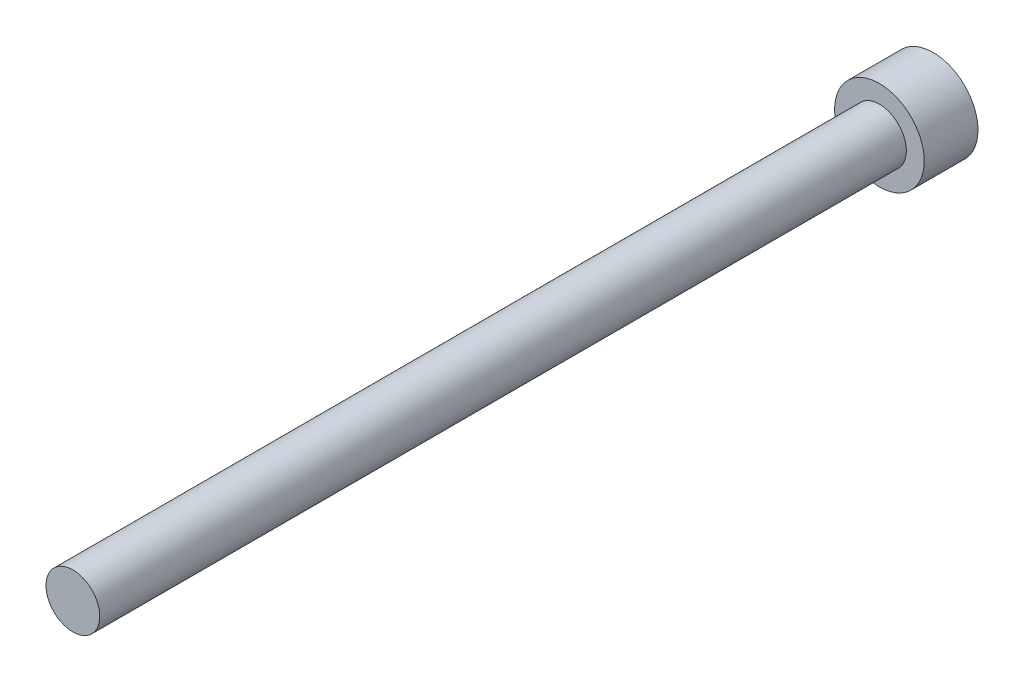
ISO-10303-21;
HEADER;
FILE_DESCRIPTION(('STEP AP214'),'2;1');
FILE_NAME('part.step','',(''),(''),'','','');
FILE_SCHEMA(('AUTOMOTIVE_DESIGN { 1 0 10303 214 1 1 1 1 }'));
ENDSEC;
DATA;
#1=APPLICATION_CONTEXT('core data for automotive mechanical design processes');
#2=APPLICATION_PROTOCOL_DEFINITION('international standard','automotive_design',2000,#1);
#3=PRODUCT_CONTEXT('',#1,'mechanical');
#4=PRODUCT('Part','Part','',(#3));
#5=PRODUCT_RELATED_PRODUCT_CATEGORY('part','',(#4));
#6=PRODUCT_DEFINITION_FORMATION('','',#4);
#7=PRODUCT_DEFINITION_CONTEXT('part definition',#1,'design');
#8=PRODUCT_DEFINITION('design','',#6,#7);
#9=PRODUCT_DEFINITION_SHAPE('','',#8);
#10=(LENGTH_UNIT() NAMED_UNIT(*) SI_UNIT(.MILLI.,.METRE.));
#11=(NAMED_UNIT(*) PLANE_ANGLE_UNIT() SI_UNIT($,.RADIAN.));
#12=(NAMED_UNIT(*) SI_UNIT($,.STERADIAN.) SOLID_ANGLE_UNIT());
#13=UNCERTAINTY_MEASURE_WITH_UNIT(LENGTH_MEASURE(1.E-05),#10,'distance_accuracy_value','');
#14=(GEOMETRIC_REPRESENTATION_CONTEXT(3) GLOBAL_UNCERTAINTY_ASSIGNED_CONTEXT((#13)) GLOBAL_UNIT_ASSIGNED_CONTEXT((#10,
#11,#12)) REPRESENTATION_CONTEXT('',''));
#15=CARTESIAN_POINT('',(0.,0.,0.));
#16=DIRECTION('',(0.,0.,1.));
#17=DIRECTION('',(1.,0.,0.));
#18=AXIS2_PLACEMENT_3D('',#15,#16,#17);
#19=CARTESIAN_POINT('',(0.,0.,0.));
#20=DIRECTION('',(0.,0.,-1.));
#21=DIRECTION('',(-1.,0.,0.));
#22=AXIS2_PLACEMENT_3D('',#19,#20,#21);
#23=CYLINDRICAL_SURFACE('',#22,5.);
#24=CARTESIAN_POINT('',(0.,0.,0.));
#25=DIRECTION('',(0.,0.,1.));
#26=DIRECTION('',(1.,0.,0.));
#27=AXIS2_PLACEMENT_3D('',#24,#25,#26);
#28=CIRCLE('',#27,5.);
#29=CARTESIAN_POINT('',(5.,0.,0.));
#30=VERTEX_POINT('',#29);
#31=EDGE_CURVE('E42',#30,#30,#28,.T.);
#32=ORIENTED_EDGE('',*,*,#31,.F.);
#33=EDGE_LOOP('',(#32));
#34=FACE_BOUND('',#33,.T.);
#35=CARTESIAN_POINT('',(0.,0.,-6.));
#36=DIRECTION('',(0.,0.,1.));
#37=DIRECTION('',(1.,0.,0.));
#38=AXIS2_PLACEMENT_3D('',#35,#36,#37);
#39=CIRCLE('',#38,5.);
#40=CARTESIAN_POINT('',(5.,0.,-6.));
#41=VERTEX_POINT('',#40);
#42=EDGE_CURVE('E37',#41,#41,#39,.T.);
#43=ORIENTED_EDGE('',*,*,#42,.T.);
#44=EDGE_LOOP('',(#43));
#45=FACE_BOUND('',#44,.T.);
#46=ADVANCED_FACE('F40',(#34,#45),#23,.T.);
#47=CARTESIAN_POINT('',(0.,0.,0.));
#48=DIRECTION('',(0.,0.,1.));
#49=DIRECTION('',(1.,0.,0.));
#50=AXIS2_PLACEMENT_3D('',#47,#48,#49);
#51=PLANE('',#50);
#52=CARTESIAN_POINT('',(0.,0.,0.));
#53=DIRECTION('',(0.,0.,1.));
#54=DIRECTION('',(1.,0.,0.));
#55=AXIS2_PLACEMENT_3D('',#52,#53,#54);
#56=CIRCLE('',#55,3.);
#57=CARTESIAN_POINT('',(-3.,0.,0.));
#58=VERTEX_POINT('',#57);
#59=EDGE_CURVE('E10',#58,#58,#56,.T.);
#60=ORIENTED_EDGE('',*,*,#59,.F.);
#61=EDGE_LOOP('',(#60));
#62=FACE_BOUND('',#61,.T.);
#63=ORIENTED_EDGE('',*,*,#31,.T.);
#64=EDGE_LOOP('',(#63));
#65=FACE_BOUND('',#64,.T.);
#66=ADVANCED_FACE('F62',(#62,#65),#51,.T.);
#67=CARTESIAN_POINT('',(0.,0.,-6.));
#68=DIRECTION('',(0.,0.,1.));
#69=DIRECTION('',(1.,0.,0.));
#70=AXIS2_PLACEMENT_3D('',#67,#68,#69);
#71=PLANE('',#70);
#72=ORIENTED_EDGE('',*,*,#42,.F.);
#73=EDGE_LOOP('',(#72));
#74=FACE_BOUND('',#73,.T.);
#75=ADVANCED_FACE('F59',(#74),#71,.F.);
#76=CARTESIAN_POINT('',(0.,0.,90.));
#77=DIRECTION('',(0.,0.,-1.));
#78=DIRECTION('',(-1.,0.,0.));
#79=AXIS2_PLACEMENT_3D('',#76,#77,#78);
#80=CYLINDRICAL_SURFACE('',#79,3.);
#81=CARTESIAN_POINT('',(0.,0.,90.));
#82=DIRECTION('',(0.,0.,1.));
#83=DIRECTION('',(1.,0.,0.));
#84=AXIS2_PLACEMENT_3D('',#81,#82,#83);
#85=CIRCLE('',#84,3.);
#86=CARTESIAN_POINT('',(-3.,0.,90.));
#87=VERTEX_POINT('',#86);
#88=EDGE_CURVE('E49',#87,#87,#85,.T.);
#89=CARTESIAN_POINT('',(-3.,0.,90.));
#90=CARTESIAN_POINT('',(-3.,0.,89.0625));
#91=CARTESIAN_POINT('',(-3.,0.,88.125));
#92=CARTESIAN_POINT('',(-3.,0.,86.25));
#93=CARTESIAN_POINT('',(-3.,0.,85.3125));
#94=CARTESIAN_POINT('',(-3.,0.,83.4375));
#95=CARTESIAN_POINT('',(-3.,0.,82.5));
#96=CARTESIAN_POINT('',(-3.,0.,80.625));
#97=CARTESIAN_POINT('',(-3.,0.,79.6875));
#98=CARTESIAN_POINT('',(-3.,0.,77.8125));
#99=CARTESIAN_POINT('',(-3.,0.,76.875));
#100=CARTESIAN_POINT('',(-3.,0.,75.));
#101=CARTESIAN_POINT('',(-3.,0.,74.0625));
#102=CARTESIAN_POINT('',(-3.,0.,72.1875));
#103=CARTESIAN_POINT('',(-3.,0.,71.25));
#104=CARTESIAN_POINT('',(-3.,0.,69.375));
#105=CARTESIAN_POINT('',(-3.,0.,68.4375));
#106=CARTESIAN_POINT('',(-3.,0.,66.5625));
#107=CARTESIAN_POINT('',(-3.,0.,65.625));
#108=CARTESIAN_POINT('',(-3.,0.,63.75));
#109=CARTESIAN_POINT('',(-3.,0.,62.8125));
#110=CARTESIAN_POINT('',(-3.,0.,60.9375));
#111=CARTESIAN_POINT('',(-3.,0.,60.));
#112=CARTESIAN_POINT('',(-3.,0.,58.125));
#113=CARTESIAN_POINT('',(-3.,0.,57.1875));
#114=CARTESIAN_POINT('',(-3.,0.,55.3125));
#115=CARTESIAN_POINT('',(-3.,0.,54.375));
#116=CARTESIAN_POINT('',(-3.,0.,52.5));
#117=CARTESIAN_POINT('',(-3.,0.,51.5625));
#118=CARTESIAN_POINT('',(-3.,0.,49.6875));
#119=CARTESIAN_POINT('',(-3.,0.,48.75));
#120=CARTESIAN_POINT('',(-3.,0.,46.875));
#121=CARTESIAN_POINT('',(-3.,0.,45.9375));
#122=CARTESIAN_POINT('',(-3.,0.,44.0625));
#123=CARTESIAN_POINT('',(-3.,0.,43.125));
#124=CARTESIAN_POINT('',(-3.,0.,41.25));
#125=CARTESIAN_POINT('',(-3.,0.,40.3125));
#126=CARTESIAN_POINT('',(-3.,0.,38.4375));
#127=CARTESIAN_POINT('',(-3.,0.,37.5));
#128=CARTESIAN_POINT('',(-3.,0.,35.625));
#129=CARTESIAN_POINT('',(-3.,0.,34.6875));
#130=CARTESIAN_POINT('',(-3.,0.,32.8125));
#131=CARTESIAN_POINT('',(-3.,0.,31.875));
#132=CARTESIAN_POINT('',(-3.,0.,30.));
#133=CARTESIAN_POINT('',(-3.,0.,29.0625));
#134=CARTESIAN_POINT('',(-3.,0.,27.1875));
#135=CARTESIAN_POINT('',(-3.,0.,26.25));
#136=CARTESIAN_POINT('',(-3.,0.,24.375));
#137=CARTESIAN_POINT('',(-3.,0.,23.4375));
#138=CARTESIAN_POINT('',(-3.,0.,21.5625));
#139=CARTESIAN_POINT('',(-3.,0.,20.625));
#140=CARTESIAN_POINT('',(-3.,0.,18.75));
#141=CARTESIAN_POINT('',(-3.,0.,17.8125));
#142=CARTESIAN_POINT('',(-3.,0.,15.9375));
#143=CARTESIAN_POINT('',(-3.,0.,15.));
#144=CARTESIAN_POINT('',(-3.,0.,13.125));
#145=CARTESIAN_POINT('',(-3.,0.,12.1875));
#146=CARTESIAN_POINT('',(-3.,0.,10.3125));
#147=CARTESIAN_POINT('',(-3.,0.,9.37499999999999));
#148=CARTESIAN_POINT('',(-3.,0.,7.49999999999999));
#149=CARTESIAN_POINT('',(-3.,0.,6.56249999999999));
#150=CARTESIAN_POINT('',(-3.,0.,4.68749999999999));
#151=CARTESIAN_POINT('',(-3.,0.,3.74999999999998));
#152=CARTESIAN_POINT('',(-3.,0.,1.87499999999998));
#153=CARTESIAN_POINT('',(-3.,0.,0.937499999999986));
#154=CARTESIAN_POINT('',(-3.,0.,0.));
#155=B_SPLINE_CURVE_WITH_KNOTS('',3,(#89,#90,#91,#92,#93,#94,#95,#96,#97,#98,#99,#100,#101,#102,
#103,#104,#105,#106,#107,#108,#109,#110,#111,#112,#113,#114,#115,#116,#117,#118,#119,#120,#121,
#122,#123,#124,#125,#126,#127,#128,#129,#130,#131,#132,#133,#134,#135,#136,#137,#138,#139,#140,
#141,#142,#143,#144,#145,#146,#147,#148,#149,#150,#151,#152,#153,#154),.UNSPECIFIED.,.F.,.F.,(4,
2,2,2,2,2,2,2,2,2,2,2,2,2,2,2,2,2,2,2,2,2,2,2,2,2,2,2,2,2,2,2,4),(0.,2.8125,5.62499999999999,
8.43749999999999,11.25,14.0625,16.875,19.6875,22.5,25.3125,28.125,30.9375,33.75,36.5625,39.375,
42.1875,45.,47.8125,50.625,53.4375,56.25,59.0625,61.875,64.6875,67.5,70.3125,73.125,75.9375,
78.75,81.5625,84.375,87.1875,90.),.UNSPECIFIED.);
#156=EDGE_CURVE('BSEAM58',#87,#58,#155,.T.);
#157=ORIENTED_EDGE('',*,*,#88,.F.);
#158=ORIENTED_EDGE('',*,*,#59,.T.);
#159=ORIENTED_EDGE('',*,*,#156,.T.);
#160=ORIENTED_EDGE('',*,*,#156,.F.);
#161=EDGE_LOOP('',(#157,#159,#158,#160));
#162=FACE_BOUND('',#161,.T.);
#163=ADVANCED_FACE('F58',(#162),#80,.T.);
#164=CARTESIAN_POINT('',(0.,0.,90.));
#165=DIRECTION('',(0.,0.,1.));
#166=DIRECTION('',(1.,0.,0.));
#167=AXIS2_PLACEMENT_3D('',#164,#165,#166);
#168=PLANE('',#167);
#169=ORIENTED_EDGE('',*,*,#88,.T.);
#170=EDGE_LOOP('',(#169));
#171=FACE_BOUND('',#170,.T.);
#172=ADVANCED_FACE('F70',(#171),#168,.T.);
#173=CLOSED_SHELL('',(#46,#66,#75,#163,#172));
#174=MANIFOLD_SOLID_BREP('B2',#173);
#175=ADVANCED_BREP_SHAPE_REPRESENTATION('',(#18,#174),#14);
#176=SHAPE_DEFINITION_REPRESENTATION(#9,#175);
ENDSEC;
END-ISO-10303-21;
